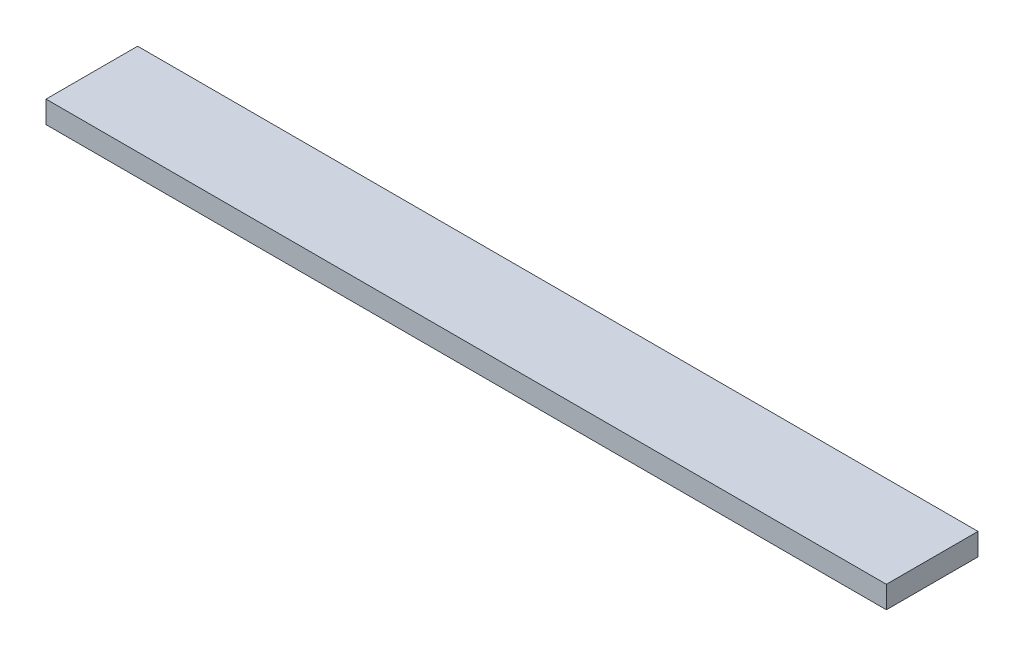
ISO-10303-21;
HEADER;
FILE_DESCRIPTION(('STEP AP214'),'2;1');
FILE_NAME('part.step','',(''),(''),'','','');
FILE_SCHEMA(('AUTOMOTIVE_DESIGN { 1 0 10303 214 1 1 1 1 }'));
ENDSEC;
DATA;
#1=APPLICATION_CONTEXT('core data for automotive mechanical design processes');
#2=APPLICATION_PROTOCOL_DEFINITION('international standard','automotive_design',2000,#1);
#3=PRODUCT_CONTEXT('',#1,'mechanical');
#4=PRODUCT('Part','Part','',(#3));
#5=PRODUCT_RELATED_PRODUCT_CATEGORY('part','',(#4));
#6=PRODUCT_DEFINITION_FORMATION('','',#4);
#7=PRODUCT_DEFINITION_CONTEXT('part definition',#1,'design');
#8=PRODUCT_DEFINITION('design','',#6,#7);
#9=PRODUCT_DEFINITION_SHAPE('','',#8);
#10=(LENGTH_UNIT() NAMED_UNIT(*) SI_UNIT(.MILLI.,.METRE.));
#11=(NAMED_UNIT(*) PLANE_ANGLE_UNIT() SI_UNIT($,.RADIAN.));
#12=(NAMED_UNIT(*) SI_UNIT($,.STERADIAN.) SOLID_ANGLE_UNIT());
#13=UNCERTAINTY_MEASURE_WITH_UNIT(LENGTH_MEASURE(1.E-05),#10,'distance_accuracy_value','');
#14=(GEOMETRIC_REPRESENTATION_CONTEXT(3) GLOBAL_UNCERTAINTY_ASSIGNED_CONTEXT((#13)) GLOBAL_UNIT_ASSIGNED_CONTEXT((#10,
#11,#12)) REPRESENTATION_CONTEXT('',''));
#15=CARTESIAN_POINT('',(0.,0.,0.));
#16=DIRECTION('',(0.,0.,1.));
#17=DIRECTION('',(1.,0.,0.));
#18=AXIS2_PLACEMENT_3D('',#15,#16,#17);
#19=CARTESIAN_POINT('',(0.,1.035,3.25));
#20=DIRECTION('',(0.,1.,0.));
#21=DIRECTION('',(0.,0.,1.));
#22=AXIS2_PLACEMENT_3D('',#19,#20,#21);
#23=PLANE('',#22);
#24=DIRECTION('',(0.,0.,1.));
#25=VECTOR('',#24,1.);
#26=CARTESIAN_POINT('',(-13.3,1.035,1.8));
#27=LINE('',#26,#25);
#28=CARTESIAN_POINT('',(-13.3,1.035,1.8));
#29=VERTEX_POINT('',#28);
#30=CARTESIAN_POINT('',(-13.3,1.035,4.70000000000001));
#31=VERTEX_POINT('',#30);
#32=EDGE_CURVE('E79',#29,#31,#27,.T.);
#33=ORIENTED_EDGE('',*,*,#32,.F.);
#34=DIRECTION('',(-1.,0.,0.));
#35=VECTOR('',#34,1.);
#36=CARTESIAN_POINT('',(13.3,1.035,1.8));
#37=LINE('',#36,#35);
#38=CARTESIAN_POINT('',(13.3,1.035,1.8));
#39=VERTEX_POINT('',#38);
#40=EDGE_CURVE('E55',#39,#29,#37,.T.);
#41=ORIENTED_EDGE('',*,*,#40,.F.);
#42=DIRECTION('',(0.,0.,-1.));
#43=VECTOR('',#42,1.);
#44=CARTESIAN_POINT('',(13.3,1.035,4.70000000000001));
#45=LINE('',#44,#43);
#46=CARTESIAN_POINT('',(13.3,1.035,4.70000000000001));
#47=VERTEX_POINT('',#46);
#48=EDGE_CURVE('E57',#47,#39,#45,.T.);
#49=ORIENTED_EDGE('',*,*,#48,.F.);
#50=DIRECTION('',(1.,0.,0.));
#51=VECTOR('',#50,1.);
#52=CARTESIAN_POINT('',(-13.3,1.035,4.70000000000001));
#53=LINE('',#52,#51);
#54=EDGE_CURVE('E20',#31,#47,#53,.T.);
#55=ORIENTED_EDGE('',*,*,#54,.F.);
#56=EDGE_LOOP('',(#33,#41,#49,#55));
#57=FACE_BOUND('',#56,.T.);
#58=ADVANCED_FACE('F17',(#57),#23,.F.);
#59=CARTESIAN_POINT('',(-13.3,1.035,4.70000000000001));
#60=DIRECTION('',(0.,0.,1.));
#61=DIRECTION('',(1.,0.,0.));
#62=AXIS2_PLACEMENT_3D('',#59,#60,#61);
#63=PLANE('',#62);
#64=DIRECTION('',(1.,0.,0.));
#65=VECTOR('',#64,1.);
#66=CARTESIAN_POINT('',(0.,1.735,4.70000000000001));
#67=LINE('',#66,#65);
#68=CARTESIAN_POINT('',(-13.3,1.735,4.70000000000001));
#69=VERTEX_POINT('',#68);
#70=CARTESIAN_POINT('',(13.3,1.735,4.70000000000001));
#71=VERTEX_POINT('',#70);
#72=EDGE_CURVE('E83',#69,#71,#67,.T.);
#73=ORIENTED_EDGE('',*,*,#72,.F.);
#74=DIRECTION('',(0.,1.,0.));
#75=VECTOR('',#74,1.);
#76=CARTESIAN_POINT('',(-13.3,1.035,4.70000000000001));
#77=LINE('',#76,#75);
#78=EDGE_CURVE('E68',#31,#69,#77,.T.);
#79=ORIENTED_EDGE('',*,*,#78,.F.);
#80=ORIENTED_EDGE('',*,*,#54,.T.);
#81=DIRECTION('',(0.,1.,0.));
#82=VECTOR('',#81,1.);
#83=CARTESIAN_POINT('',(13.3,1.035,4.70000000000001));
#84=LINE('',#83,#82);
#85=EDGE_CURVE('E63',#71,#47,#84,.F.);
#86=ORIENTED_EDGE('',*,*,#85,.F.);
#87=EDGE_LOOP('',(#73,#79,#80,#86));
#88=FACE_BOUND('',#87,.T.);
#89=ADVANCED_FACE('F65',(#88),#63,.T.);
#90=CARTESIAN_POINT('',(13.3,1.035,4.70000000000001));
#91=DIRECTION('',(1.,0.,0.));
#92=DIRECTION('',(0.,0.,-1.));
#93=AXIS2_PLACEMENT_3D('',#90,#91,#92);
#94=PLANE('',#93);
#95=DIRECTION('',(0.,0.,1.));
#96=VECTOR('',#95,1.);
#97=CARTESIAN_POINT('',(13.3,1.735,3.25));
#98=LINE('',#97,#96);
#99=CARTESIAN_POINT('',(13.3,1.735,1.8));
#100=VERTEX_POINT('',#99);
#101=EDGE_CURVE('E72',#71,#100,#98,.F.);
#102=ORIENTED_EDGE('',*,*,#101,.F.);
#103=ORIENTED_EDGE('',*,*,#85,.T.);
#104=ORIENTED_EDGE('',*,*,#48,.T.);
#105=DIRECTION('',(0.,1.,0.));
#106=VECTOR('',#105,1.);
#107=CARTESIAN_POINT('',(13.3,1.035,1.8));
#108=LINE('',#107,#106);
#109=EDGE_CURVE('E75',#100,#39,#108,.F.);
#110=ORIENTED_EDGE('',*,*,#109,.F.);
#111=EDGE_LOOP('',(#102,#103,#104,#110));
#112=FACE_BOUND('',#111,.T.);
#113=ADVANCED_FACE('F70',(#112),#94,.T.);
#114=CARTESIAN_POINT('',(13.3,1.035,1.8));
#115=DIRECTION('',(0.,0.,-1.));
#116=DIRECTION('',(-1.,0.,0.));
#117=AXIS2_PLACEMENT_3D('',#114,#115,#116);
#118=PLANE('',#117);
#119=DIRECTION('',(1.,0.,0.));
#120=VECTOR('',#119,1.);
#121=CARTESIAN_POINT('',(0.,1.735,1.8));
#122=LINE('',#121,#120);
#123=CARTESIAN_POINT('',(-13.3,1.735,1.8));
#124=VERTEX_POINT('',#123);
#125=EDGE_CURVE('E26',#100,#124,#122,.F.);
#126=ORIENTED_EDGE('',*,*,#125,.F.);
#127=ORIENTED_EDGE('',*,*,#109,.T.);
#128=ORIENTED_EDGE('',*,*,#40,.T.);
#129=DIRECTION('',(0.,1.,0.));
#130=VECTOR('',#129,1.);
#131=CARTESIAN_POINT('',(-13.3,1.035,1.8));
#132=LINE('',#131,#130);
#133=EDGE_CURVE('E35',#124,#29,#132,.F.);
#134=ORIENTED_EDGE('',*,*,#133,.F.);
#135=EDGE_LOOP('',(#126,#127,#128,#134));
#136=FACE_BOUND('',#135,.T.);
#137=ADVANCED_FACE('F89',(#136),#118,.T.);
#138=CARTESIAN_POINT('',(-13.3,1.035,1.8));
#139=DIRECTION('',(-1.,0.,0.));
#140=DIRECTION('',(0.,0.,1.));
#141=AXIS2_PLACEMENT_3D('',#138,#139,#140);
#142=PLANE('',#141);
#143=DIRECTION('',(0.,0.,1.));
#144=VECTOR('',#143,1.);
#145=CARTESIAN_POINT('',(-13.3,1.735,3.25));
#146=LINE('',#145,#144);
#147=EDGE_CURVE('E11',#124,#69,#146,.T.);
#148=ORIENTED_EDGE('',*,*,#147,.F.);
#149=ORIENTED_EDGE('',*,*,#133,.T.);
#150=ORIENTED_EDGE('',*,*,#32,.T.);
#151=ORIENTED_EDGE('',*,*,#78,.T.);
#152=EDGE_LOOP('',(#148,#149,#150,#151));
#153=FACE_BOUND('',#152,.T.);
#154=ADVANCED_FACE('F91',(#153),#142,.T.);
#155=CARTESIAN_POINT('',(0.,1.735,3.25));
#156=DIRECTION('',(0.,1.,0.));
#157=DIRECTION('',(0.,0.,1.));
#158=AXIS2_PLACEMENT_3D('',#155,#156,#157);
#159=PLANE('',#158);
#160=ORIENTED_EDGE('',*,*,#125,.T.);
#161=ORIENTED_EDGE('',*,*,#147,.T.);
#162=ORIENTED_EDGE('',*,*,#72,.T.);
#163=ORIENTED_EDGE('',*,*,#101,.T.);
#164=EDGE_LOOP('',(#160,#161,#162,#163));
#165=FACE_BOUND('',#164,.T.);
#166=ADVANCED_FACE('F88',(#165),#159,.T.);
#167=CLOSED_SHELL('',(#58,#89,#113,#137,#154,#166));
#168=MANIFOLD_SOLID_BREP('B1',#167);
#169=ADVANCED_BREP_SHAPE_REPRESENTATION('',(#18,#168),#14);
#170=SHAPE_DEFINITION_REPRESENTATION(#9,#169);
ENDSEC;
END-ISO-10303-21;
